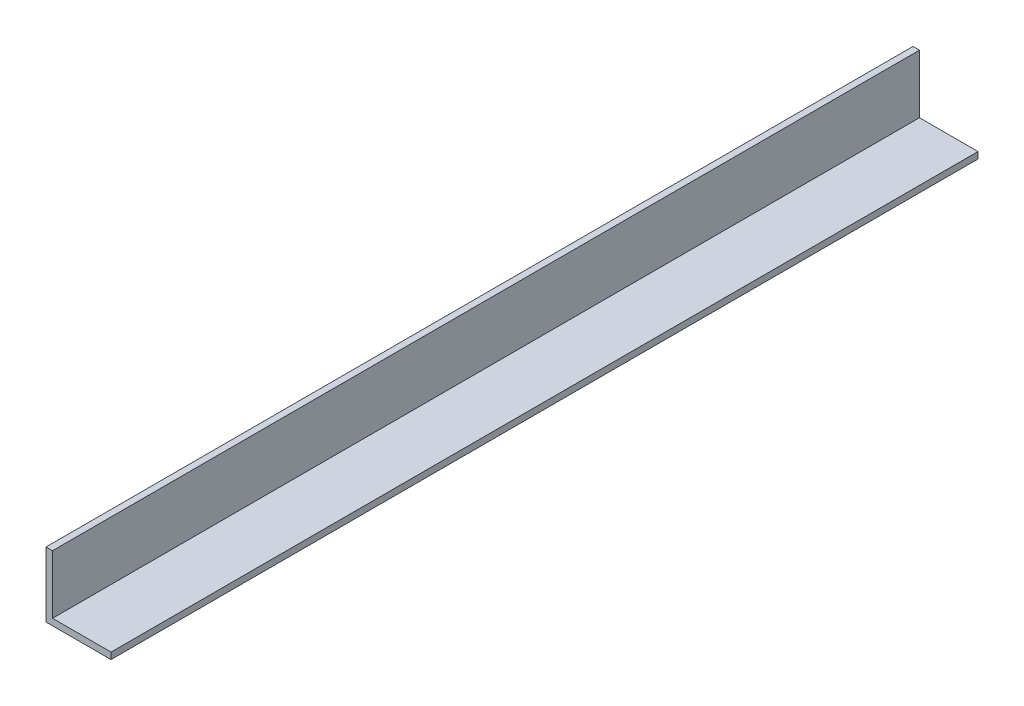
ISO-10303-21;
HEADER;
FILE_DESCRIPTION(('STEP AP214'),'2;1');
FILE_NAME('part.step','',(''),(''),'','','');
FILE_SCHEMA(('AUTOMOTIVE_DESIGN { 1 0 10303 214 1 1 1 1 }'));
ENDSEC;
DATA;
#1=APPLICATION_CONTEXT('core data for automotive mechanical design processes');
#2=APPLICATION_PROTOCOL_DEFINITION('international standard','automotive_design',2000,#1);
#3=PRODUCT_CONTEXT('',#1,'mechanical');
#4=PRODUCT('Part','Part','',(#3));
#5=PRODUCT_RELATED_PRODUCT_CATEGORY('part','',(#4));
#6=PRODUCT_DEFINITION_FORMATION('','',#4);
#7=PRODUCT_DEFINITION_CONTEXT('part definition',#1,'design');
#8=PRODUCT_DEFINITION('design','',#6,#7);
#9=PRODUCT_DEFINITION_SHAPE('','',#8);
#10=(LENGTH_UNIT() NAMED_UNIT(*) SI_UNIT(.MILLI.,.METRE.));
#11=(NAMED_UNIT(*) PLANE_ANGLE_UNIT() SI_UNIT($,.RADIAN.));
#12=(NAMED_UNIT(*) SI_UNIT($,.STERADIAN.) SOLID_ANGLE_UNIT());
#13=UNCERTAINTY_MEASURE_WITH_UNIT(LENGTH_MEASURE(1.E-05),#10,'distance_accuracy_value','');
#14=(GEOMETRIC_REPRESENTATION_CONTEXT(3) GLOBAL_UNCERTAINTY_ASSIGNED_CONTEXT((#13)) GLOBAL_UNIT_ASSIGNED_CONTEXT((#10,
#11,#12)) REPRESENTATION_CONTEXT('',''));
#15=CARTESIAN_POINT('',(0.,0.,0.));
#16=DIRECTION('',(0.,0.,1.));
#17=DIRECTION('',(1.,0.,0.));
#18=AXIS2_PLACEMENT_3D('',#15,#16,#17);
#19=CARTESIAN_POINT('',(3.,30.,400.));
#20=DIRECTION('',(0.,-1.,0.));
#21=DIRECTION('',(0.,0.,-1.));
#22=AXIS2_PLACEMENT_3D('',#19,#20,#21);
#23=PLANE('',#22);
#24=DIRECTION('',(-1.,0.,0.));
#25=VECTOR('',#24,1.);
#26=CARTESIAN_POINT('',(3.,30.,0.));
#27=LINE('',#26,#25);
#28=CARTESIAN_POINT('',(3.,30.,0.));
#29=VERTEX_POINT('',#28);
#30=CARTESIAN_POINT('',(0.,30.,0.));
#31=VERTEX_POINT('',#30);
#32=EDGE_CURVE('E118',#29,#31,#27,.T.);
#33=ORIENTED_EDGE('',*,*,#32,.T.);
#34=DIRECTION('',(0.,0.,-1.));
#35=VECTOR('',#34,1.);
#36=CARTESIAN_POINT('',(0.,30.,400.));
#37=LINE('',#36,#35);
#38=CARTESIAN_POINT('',(0.,30.,400.));
#39=VERTEX_POINT('',#38);
#40=EDGE_CURVE('E11',#39,#31,#37,.T.);
#41=ORIENTED_EDGE('',*,*,#40,.F.);
#42=DIRECTION('',(-1.,0.,0.));
#43=VECTOR('',#42,1.);
#44=CARTESIAN_POINT('',(3.,30.,400.));
#45=LINE('',#44,#43);
#46=CARTESIAN_POINT('',(3.,30.,400.));
#47=VERTEX_POINT('',#46);
#48=EDGE_CURVE('E128',#47,#39,#45,.T.);
#49=ORIENTED_EDGE('',*,*,#48,.F.);
#50=DIRECTION('',(0.,0.,-1.));
#51=VECTOR('',#50,1.);
#52=CARTESIAN_POINT('',(3.,30.,400.));
#53=LINE('',#52,#51);
#54=EDGE_CURVE('E114',#47,#29,#53,.T.);
#55=ORIENTED_EDGE('',*,*,#54,.T.);
#56=EDGE_LOOP('',(#33,#41,#49,#55));
#57=FACE_BOUND('',#56,.T.);
#58=ADVANCED_FACE('F34',(#57),#23,.F.);
#59=CARTESIAN_POINT('',(0.,30.,400.));
#60=DIRECTION('',(1.,0.,0.));
#61=DIRECTION('',(0.,0.,-1.));
#62=AXIS2_PLACEMENT_3D('',#59,#60,#61);
#63=PLANE('',#62);
#64=DIRECTION('',(0.,-1.,0.));
#65=VECTOR('',#64,1.);
#66=CARTESIAN_POINT('',(0.,30.,0.));
#67=LINE('',#66,#65);
#68=CARTESIAN_POINT('',(0.,0.,0.));
#69=VERTEX_POINT('',#68);
#70=EDGE_CURVE('E121',#31,#69,#67,.T.);
#71=ORIENTED_EDGE('',*,*,#70,.T.);
#72=DIRECTION('',(0.,0.,-1.));
#73=VECTOR('',#72,1.);
#74=CARTESIAN_POINT('',(0.,0.,400.));
#75=LINE('',#74,#73);
#76=CARTESIAN_POINT('',(0.,0.,400.));
#77=VERTEX_POINT('',#76);
#78=EDGE_CURVE('E42',#77,#69,#75,.T.);
#79=ORIENTED_EDGE('',*,*,#78,.F.);
#80=DIRECTION('',(0.,-1.,0.));
#81=VECTOR('',#80,1.);
#82=CARTESIAN_POINT('',(0.,30.,400.));
#83=LINE('',#82,#81);
#84=EDGE_CURVE('E87',#39,#77,#83,.T.);
#85=ORIENTED_EDGE('',*,*,#84,.F.);
#86=ORIENTED_EDGE('',*,*,#40,.T.);
#87=EDGE_LOOP('',(#71,#79,#85,#86));
#88=FACE_BOUND('',#87,.T.);
#89=ADVANCED_FACE('F152',(#88),#63,.F.);
#90=CARTESIAN_POINT('',(0.,0.,400.));
#91=DIRECTION('',(0.,1.,0.));
#92=DIRECTION('',(0.,0.,1.));
#93=AXIS2_PLACEMENT_3D('',#90,#91,#92);
#94=PLANE('',#93);
#95=DIRECTION('',(1.,0.,0.));
#96=VECTOR('',#95,1.);
#97=CARTESIAN_POINT('',(0.,0.,0.));
#98=LINE('',#97,#96);
#99=CARTESIAN_POINT('',(30.,0.,0.));
#100=VERTEX_POINT('',#99);
#101=EDGE_CURVE('E123',#69,#100,#98,.T.);
#102=ORIENTED_EDGE('',*,*,#101,.T.);
#103=DIRECTION('',(0.,0.,-1.));
#104=VECTOR('',#103,1.);
#105=CARTESIAN_POINT('',(30.,0.,400.));
#106=LINE('',#105,#104);
#107=CARTESIAN_POINT('',(30.,0.,400.));
#108=VERTEX_POINT('',#107);
#109=EDGE_CURVE('E109',#108,#100,#106,.T.);
#110=ORIENTED_EDGE('',*,*,#109,.F.);
#111=DIRECTION('',(1.,0.,0.));
#112=VECTOR('',#111,1.);
#113=CARTESIAN_POINT('',(0.,0.,400.));
#114=LINE('',#113,#112);
#115=EDGE_CURVE('E100',#77,#108,#114,.T.);
#116=ORIENTED_EDGE('',*,*,#115,.F.);
#117=ORIENTED_EDGE('',*,*,#78,.T.);
#118=EDGE_LOOP('',(#102,#110,#116,#117));
#119=FACE_BOUND('',#118,.T.);
#120=ADVANCED_FACE('F134',(#119),#94,.F.);
#121=CARTESIAN_POINT('',(30.,0.,400.));
#122=DIRECTION('',(-1.,0.,0.));
#123=DIRECTION('',(0.,0.,1.));
#124=AXIS2_PLACEMENT_3D('',#121,#122,#123);
#125=PLANE('',#124);
#126=DIRECTION('',(0.,1.,0.));
#127=VECTOR('',#126,1.);
#128=CARTESIAN_POINT('',(30.,0.,0.));
#129=LINE('',#128,#127);
#130=CARTESIAN_POINT('',(30.,3.,0.));
#131=VERTEX_POINT('',#130);
#132=EDGE_CURVE('E108',#100,#131,#129,.T.);
#133=ORIENTED_EDGE('',*,*,#132,.T.);
#134=DIRECTION('',(0.,0.,-1.));
#135=VECTOR('',#134,1.);
#136=CARTESIAN_POINT('',(30.,3.,400.));
#137=LINE('',#136,#135);
#138=CARTESIAN_POINT('',(30.,3.,400.));
#139=VERTEX_POINT('',#138);
#140=EDGE_CURVE('E105',#139,#131,#137,.T.);
#141=ORIENTED_EDGE('',*,*,#140,.F.);
#142=DIRECTION('',(0.,1.,0.));
#143=VECTOR('',#142,1.);
#144=CARTESIAN_POINT('',(30.,0.,400.));
#145=LINE('',#144,#143);
#146=EDGE_CURVE('E94',#108,#139,#145,.T.);
#147=ORIENTED_EDGE('',*,*,#146,.F.);
#148=ORIENTED_EDGE('',*,*,#109,.T.);
#149=EDGE_LOOP('',(#133,#141,#147,#148));
#150=FACE_BOUND('',#149,.T.);
#151=ADVANCED_FACE('F106',(#150),#125,.F.);
#152=CARTESIAN_POINT('',(30.,3.,400.));
#153=DIRECTION('',(0.,-1.,0.));
#154=DIRECTION('',(1.,0.,0.));
#155=AXIS2_PLACEMENT_3D('',#152,#153,#154);
#156=PLANE('',#155);
#157=DIRECTION('',(-1.,0.,0.));
#158=VECTOR('',#157,1.);
#159=CARTESIAN_POINT('',(30.,3.,0.));
#160=LINE('',#159,#158);
#161=CARTESIAN_POINT('',(3.,3.,0.));
#162=VERTEX_POINT('',#161);
#163=EDGE_CURVE('E73',#131,#162,#160,.T.);
#164=ORIENTED_EDGE('',*,*,#163,.T.);
#165=DIRECTION('',(0.,0.,-1.));
#166=VECTOR('',#165,1.);
#167=CARTESIAN_POINT('',(3.,3.,400.));
#168=LINE('',#167,#166);
#169=CARTESIAN_POINT('',(3.,3.,400.));
#170=VERTEX_POINT('',#169);
#171=EDGE_CURVE('E110',#170,#162,#168,.T.);
#172=ORIENTED_EDGE('',*,*,#171,.F.);
#173=DIRECTION('',(-1.,0.,0.));
#174=VECTOR('',#173,1.);
#175=CARTESIAN_POINT('',(30.,3.,400.));
#176=LINE('',#175,#174);
#177=EDGE_CURVE('E98',#139,#170,#176,.T.);
#178=ORIENTED_EDGE('',*,*,#177,.F.);
#179=ORIENTED_EDGE('',*,*,#140,.T.);
#180=EDGE_LOOP('',(#164,#172,#178,#179));
#181=FACE_BOUND('',#180,.T.);
#182=ADVANCED_FACE('F112',(#181),#156,.F.);
#183=CARTESIAN_POINT('',(3.,3.,400.));
#184=DIRECTION('',(-1.,0.,0.));
#185=DIRECTION('',(0.,0.,1.));
#186=AXIS2_PLACEMENT_3D('',#183,#184,#185);
#187=PLANE('',#186);
#188=DIRECTION('',(0.,1.,0.));
#189=VECTOR('',#188,1.);
#190=CARTESIAN_POINT('',(3.,3.,0.));
#191=LINE('',#190,#189);
#192=EDGE_CURVE('E79',#162,#29,#191,.T.);
#193=ORIENTED_EDGE('',*,*,#192,.T.);
#194=ORIENTED_EDGE('',*,*,#54,.F.);
#195=DIRECTION('',(0.,1.,0.));
#196=VECTOR('',#195,1.);
#197=CARTESIAN_POINT('',(3.,3.,400.));
#198=LINE('',#197,#196);
#199=EDGE_CURVE('E50',#170,#47,#198,.T.);
#200=ORIENTED_EDGE('',*,*,#199,.F.);
#201=ORIENTED_EDGE('',*,*,#171,.T.);
#202=EDGE_LOOP('',(#193,#194,#200,#201));
#203=FACE_BOUND('',#202,.T.);
#204=ADVANCED_FACE('F141',(#203),#187,.F.);
#205=CARTESIAN_POINT('',(0.,0.,400.));
#206=DIRECTION('',(0.,0.,1.));
#207=DIRECTION('',(1.,0.,0.));
#208=AXIS2_PLACEMENT_3D('',#205,#206,#207);
#209=PLANE('',#208);
#210=ORIENTED_EDGE('',*,*,#48,.T.);
#211=ORIENTED_EDGE('',*,*,#84,.T.);
#212=ORIENTED_EDGE('',*,*,#115,.T.);
#213=ORIENTED_EDGE('',*,*,#146,.T.);
#214=ORIENTED_EDGE('',*,*,#177,.T.);
#215=ORIENTED_EDGE('',*,*,#199,.T.);
#216=EDGE_LOOP('',(#210,#211,#212,#213,#214,#215));
#217=FACE_BOUND('',#216,.T.);
#218=ADVANCED_FACE('F96',(#217),#209,.T.);
#219=CARTESIAN_POINT('',(0.,0.,0.));
#220=DIRECTION('',(0.,0.,1.));
#221=DIRECTION('',(1.,0.,0.));
#222=AXIS2_PLACEMENT_3D('',#219,#220,#221);
#223=PLANE('',#222);
#224=ORIENTED_EDGE('',*,*,#32,.F.);
#225=ORIENTED_EDGE('',*,*,#192,.F.);
#226=ORIENTED_EDGE('',*,*,#163,.F.);
#227=ORIENTED_EDGE('',*,*,#132,.F.);
#228=ORIENTED_EDGE('',*,*,#101,.F.);
#229=ORIENTED_EDGE('',*,*,#70,.F.);
#230=EDGE_LOOP('',(#224,#225,#226,#227,#228,#229));
#231=FACE_BOUND('',#230,.T.);
#232=ADVANCED_FACE('F137',(#231),#223,.F.);
#233=CLOSED_SHELL('',(#58,#89,#120,#151,#182,#204,#218,#232));
#234=MANIFOLD_SOLID_BREP('B2',#233);
#235=ADVANCED_BREP_SHAPE_REPRESENTATION('',(#18,#234),#14);
#236=SHAPE_DEFINITION_REPRESENTATION(#9,#235);
ENDSEC;
END-ISO-10303-21;
